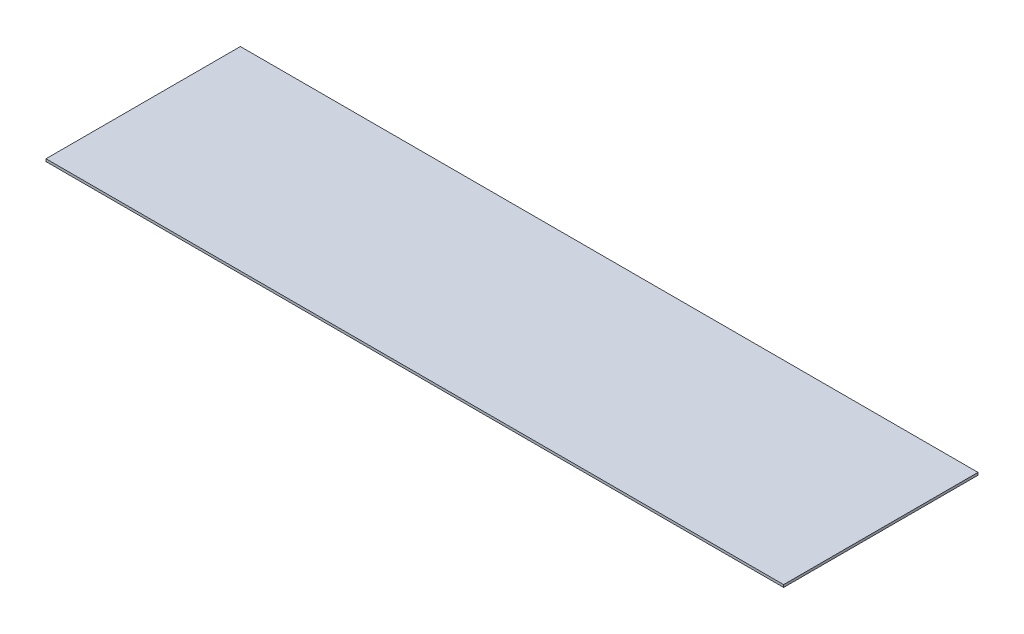
ISO-10303-21;
HEADER;
FILE_DESCRIPTION(('STEP AP214'),'2;1');
FILE_NAME('part.step','',(''),(''),'','','');
FILE_SCHEMA(('AUTOMOTIVE_DESIGN { 1 0 10303 214 1 1 1 1 }'));
ENDSEC;
DATA;
#1=APPLICATION_CONTEXT('core data for automotive mechanical design processes');
#2=APPLICATION_PROTOCOL_DEFINITION('international standard','automotive_design',2000,#1);
#3=PRODUCT_CONTEXT('',#1,'mechanical');
#4=PRODUCT('Part','Part','',(#3));
#5=PRODUCT_RELATED_PRODUCT_CATEGORY('part','',(#4));
#6=PRODUCT_DEFINITION_FORMATION('','',#4);
#7=PRODUCT_DEFINITION_CONTEXT('part definition',#1,'design');
#8=PRODUCT_DEFINITION('design','',#6,#7);
#9=PRODUCT_DEFINITION_SHAPE('','',#8);
#10=(LENGTH_UNIT() NAMED_UNIT(*) SI_UNIT(.MILLI.,.METRE.));
#11=(NAMED_UNIT(*) PLANE_ANGLE_UNIT() SI_UNIT($,.RADIAN.));
#12=(NAMED_UNIT(*) SI_UNIT($,.STERADIAN.) SOLID_ANGLE_UNIT());
#13=UNCERTAINTY_MEASURE_WITH_UNIT(LENGTH_MEASURE(1.E-05),#10,'distance_accuracy_value','');
#14=(GEOMETRIC_REPRESENTATION_CONTEXT(3) GLOBAL_UNCERTAINTY_ASSIGNED_CONTEXT((#13)) GLOBAL_UNIT_ASSIGNED_CONTEXT((#10,
#11,#12)) REPRESENTATION_CONTEXT('',''));
#15=CARTESIAN_POINT('',(0.,0.,0.));
#16=DIRECTION('',(0.,0.,1.));
#17=DIRECTION('',(1.,0.,0.));
#18=AXIS2_PLACEMENT_3D('',#15,#16,#17);
#19=CARTESIAN_POINT('',(-65.2189324950586,-1.5875,-30.8546967633573));
#20=DIRECTION('',(-1.,0.,0.));
#21=DIRECTION('',(0.,0.,1.));
#22=AXIS2_PLACEMENT_3D('',#19,#20,#21);
#23=PLANE('',#22);
#24=DIRECTION('',(0.,0.,1.));
#25=VECTOR('',#24,1.);
#26=CARTESIAN_POINT('',(-65.2189324950586,0.,-30.8546967633573));
#27=LINE('',#26,#25);
#28=CARTESIAN_POINT('',(-65.2189324950586,0.,-30.8546967633573));
#29=VERTEX_POINT('',#28);
#30=CARTESIAN_POINT('',(-65.2189324950586,0.,92.9703032366427));
#31=VERTEX_POINT('',#30);
#32=EDGE_CURVE('E97',#29,#31,#27,.T.);
#33=ORIENTED_EDGE('',*,*,#32,.F.);
#34=DIRECTION('',(0.,1.,0.));
#35=VECTOR('',#34,1.);
#36=CARTESIAN_POINT('',(-65.2189324950586,-1.5875,-30.8546967633573));
#37=LINE('',#36,#35);
#38=CARTESIAN_POINT('',(-65.2189324950586,-1.5875,-30.8546967633573));
#39=VERTEX_POINT('',#38);
#40=EDGE_CURVE('E11',#39,#29,#37,.T.);
#41=ORIENTED_EDGE('',*,*,#40,.F.);
#42=DIRECTION('',(0.,0.,1.));
#43=VECTOR('',#42,1.);
#44=CARTESIAN_POINT('',(-65.2189324950586,-1.5875,-30.8546967633573));
#45=LINE('',#44,#43);
#46=CARTESIAN_POINT('',(-65.2189324950586,-1.5875,92.9703032366427));
#47=VERTEX_POINT('',#46);
#48=EDGE_CURVE('E91',#39,#47,#45,.T.);
#49=ORIENTED_EDGE('',*,*,#48,.T.);
#50=DIRECTION('',(0.,1.,0.));
#51=VECTOR('',#50,1.);
#52=CARTESIAN_POINT('',(-65.2189324950586,-1.5875,92.9703032366427));
#53=LINE('',#52,#51);
#54=EDGE_CURVE('E36',#47,#31,#53,.T.);
#55=ORIENTED_EDGE('',*,*,#54,.T.);
#56=EDGE_LOOP('',(#33,#41,#49,#55));
#57=FACE_BOUND('',#56,.T.);
#58=ADVANCED_FACE('F33',(#57),#23,.T.);
#59=CARTESIAN_POINT('',(-65.2189324950586,-1.5875,-30.8546967633573));
#60=DIRECTION('',(0.,0.,-1.));
#61=DIRECTION('',(-1.,0.,0.));
#62=AXIS2_PLACEMENT_3D('',#59,#60,#61);
#63=PLANE('',#62);
#64=DIRECTION('',(-1.,0.,0.));
#65=VECTOR('',#64,1.);
#66=CARTESIAN_POINT('',(-65.2189324950586,0.,-30.8546967633573));
#67=LINE('',#66,#65);
#68=CARTESIAN_POINT('',(404.681067504941,0.,-30.8546967633573));
#69=VERTEX_POINT('',#68);
#70=EDGE_CURVE('E93',#69,#29,#67,.T.);
#71=ORIENTED_EDGE('',*,*,#70,.F.);
#72=DIRECTION('',(0.,1.,0.));
#73=VECTOR('',#72,1.);
#74=CARTESIAN_POINT('',(404.681067504941,-1.5875,-30.8546967633573));
#75=LINE('',#74,#73);
#76=CARTESIAN_POINT('',(404.681067504941,-1.5875,-30.8546967633573));
#77=VERTEX_POINT('',#76);
#78=EDGE_CURVE('E42',#77,#69,#75,.T.);
#79=ORIENTED_EDGE('',*,*,#78,.F.);
#80=DIRECTION('',(-1.,0.,0.));
#81=VECTOR('',#80,1.);
#82=CARTESIAN_POINT('',(-65.2189324950586,-1.5875,-30.8546967633573));
#83=LINE('',#82,#81);
#84=EDGE_CURVE('E88',#77,#39,#83,.T.);
#85=ORIENTED_EDGE('',*,*,#84,.T.);
#86=ORIENTED_EDGE('',*,*,#40,.T.);
#87=EDGE_LOOP('',(#71,#79,#85,#86));
#88=FACE_BOUND('',#87,.T.);
#89=ADVANCED_FACE('F107',(#88),#63,.T.);
#90=CARTESIAN_POINT('',(404.681067504941,-1.5875,-30.8546967633573));
#91=DIRECTION('',(1.,0.,0.));
#92=DIRECTION('',(0.,0.,-1.));
#93=AXIS2_PLACEMENT_3D('',#90,#91,#92);
#94=PLANE('',#93);
#95=DIRECTION('',(0.,0.,-1.));
#96=VECTOR('',#95,1.);
#97=CARTESIAN_POINT('',(404.681067504941,0.,-30.8546967633573));
#98=LINE('',#97,#96);
#99=CARTESIAN_POINT('',(404.681067504941,0.,92.9703032366427));
#100=VERTEX_POINT('',#99);
#101=EDGE_CURVE('E83',#100,#69,#98,.T.);
#102=ORIENTED_EDGE('',*,*,#101,.F.);
#103=DIRECTION('',(0.,1.,0.));
#104=VECTOR('',#103,1.);
#105=CARTESIAN_POINT('',(404.681067504941,-1.5875,92.9703032366427));
#106=LINE('',#105,#104);
#107=CARTESIAN_POINT('',(404.681067504941,-1.5875,92.9703032366427));
#108=VERTEX_POINT('',#107);
#109=EDGE_CURVE('E78',#108,#100,#106,.T.);
#110=ORIENTED_EDGE('',*,*,#109,.F.);
#111=DIRECTION('',(0.,0.,-1.));
#112=VECTOR('',#111,1.);
#113=CARTESIAN_POINT('',(404.681067504941,-1.5875,-30.8546967633573));
#114=LINE('',#113,#112);
#115=EDGE_CURVE('E81',#108,#77,#114,.T.);
#116=ORIENTED_EDGE('',*,*,#115,.T.);
#117=ORIENTED_EDGE('',*,*,#78,.T.);
#118=EDGE_LOOP('',(#102,#110,#116,#117));
#119=FACE_BOUND('',#118,.T.);
#120=ADVANCED_FACE('F80',(#119),#94,.T.);
#121=CARTESIAN_POINT('',(-65.2189324950586,-1.5875,92.9703032366427));
#122=DIRECTION('',(0.,0.,1.));
#123=DIRECTION('',(1.,0.,0.));
#124=AXIS2_PLACEMENT_3D('',#121,#122,#123);
#125=PLANE('',#124);
#126=DIRECTION('',(1.,0.,0.));
#127=VECTOR('',#126,1.);
#128=CARTESIAN_POINT('',(-65.2189324950586,0.,92.9703032366427));
#129=LINE('',#128,#127);
#130=EDGE_CURVE('E100',#31,#100,#129,.T.);
#131=ORIENTED_EDGE('',*,*,#130,.F.);
#132=ORIENTED_EDGE('',*,*,#54,.F.);
#133=DIRECTION('',(1.,0.,0.));
#134=VECTOR('',#133,1.);
#135=CARTESIAN_POINT('',(-65.2189324950586,-1.5875,92.9703032366427));
#136=LINE('',#135,#134);
#137=EDGE_CURVE('E87',#47,#108,#136,.T.);
#138=ORIENTED_EDGE('',*,*,#137,.T.);
#139=ORIENTED_EDGE('',*,*,#109,.T.);
#140=EDGE_LOOP('',(#131,#132,#138,#139));
#141=FACE_BOUND('',#140,.T.);
#142=ADVANCED_FACE('F90',(#141),#125,.T.);
#143=CARTESIAN_POINT('',(-65.2189324950586,-1.5875,92.9703032366427));
#144=DIRECTION('',(0.,1.,0.));
#145=DIRECTION('',(0.,0.,1.));
#146=AXIS2_PLACEMENT_3D('',#143,#144,#145);
#147=PLANE('',#146);
#148=ORIENTED_EDGE('',*,*,#48,.F.);
#149=ORIENTED_EDGE('',*,*,#84,.F.);
#150=ORIENTED_EDGE('',*,*,#115,.F.);
#151=ORIENTED_EDGE('',*,*,#137,.F.);
#152=EDGE_LOOP('',(#148,#149,#150,#151));
#153=FACE_BOUND('',#152,.T.);
#154=ADVANCED_FACE('F86',(#153),#147,.F.);
#155=CARTESIAN_POINT('',(-65.2189324950586,0.,92.9703032366427));
#156=DIRECTION('',(0.,1.,0.));
#157=DIRECTION('',(0.,0.,1.));
#158=AXIS2_PLACEMENT_3D('',#155,#156,#157);
#159=PLANE('',#158);
#160=ORIENTED_EDGE('',*,*,#32,.T.);
#161=ORIENTED_EDGE('',*,*,#130,.T.);
#162=ORIENTED_EDGE('',*,*,#101,.T.);
#163=ORIENTED_EDGE('',*,*,#70,.T.);
#164=EDGE_LOOP('',(#160,#161,#162,#163));
#165=FACE_BOUND('',#164,.T.);
#166=ADVANCED_FACE('F106',(#165),#159,.T.);
#167=CLOSED_SHELL('',(#58,#89,#120,#142,#154,#166));
#168=MANIFOLD_SOLID_BREP('B2',#167);
#169=ADVANCED_BREP_SHAPE_REPRESENTATION('',(#18,#168),#14);
#170=SHAPE_DEFINITION_REPRESENTATION(#9,#169);
ENDSEC;
END-ISO-10303-21;
